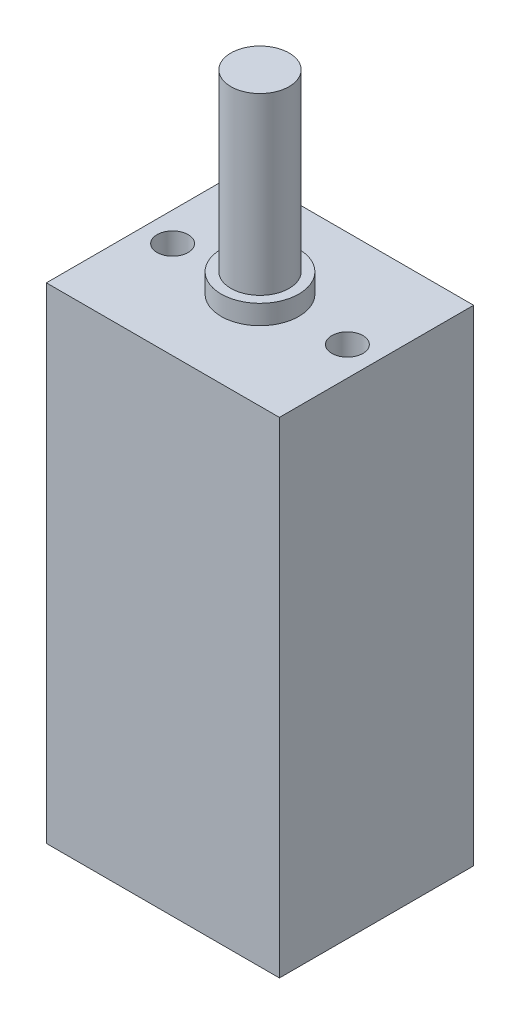
ISO-10303-21;
HEADER;
FILE_DESCRIPTION(('STEP AP214'),'2;1');
FILE_NAME('part.step','',(''),(''),'','','');
FILE_SCHEMA(('AUTOMOTIVE_DESIGN { 1 0 10303 214 1 1 1 1 }'));
ENDSEC;
DATA;
#1=APPLICATION_CONTEXT('core data for automotive mechanical design processes');
#2=APPLICATION_PROTOCOL_DEFINITION('international standard','automotive_design',2000,#1);
#3=PRODUCT_CONTEXT('',#1,'mechanical');
#4=PRODUCT('Part','Part','',(#3));
#5=PRODUCT_RELATED_PRODUCT_CATEGORY('part','',(#4));
#6=PRODUCT_DEFINITION_FORMATION('','',#4);
#7=PRODUCT_DEFINITION_CONTEXT('part definition',#1,'design');
#8=PRODUCT_DEFINITION('design','',#6,#7);
#9=PRODUCT_DEFINITION_SHAPE('','',#8);
#10=(LENGTH_UNIT() NAMED_UNIT(*) SI_UNIT(.MILLI.,.METRE.));
#11=(NAMED_UNIT(*) PLANE_ANGLE_UNIT() SI_UNIT($,.RADIAN.));
#12=(NAMED_UNIT(*) SI_UNIT($,.STERADIAN.) SOLID_ANGLE_UNIT());
#13=UNCERTAINTY_MEASURE_WITH_UNIT(LENGTH_MEASURE(1.E-05),#10,'distance_accuracy_value','');
#14=(GEOMETRIC_REPRESENTATION_CONTEXT(3) GLOBAL_UNCERTAINTY_ASSIGNED_CONTEXT((#13)) GLOBAL_UNIT_ASSIGNED_CONTEXT((#10,
#11,#12)) REPRESENTATION_CONTEXT('',''));
#15=CARTESIAN_POINT('',(0.,0.,0.));
#16=DIRECTION('',(0.,0.,1.));
#17=DIRECTION('',(1.,0.,0.));
#18=AXIS2_PLACEMENT_3D('',#15,#16,#17);
#19=CARTESIAN_POINT('',(6.,25.,-5.));
#20=DIRECTION('',(-1.,0.,0.));
#21=DIRECTION('',(0.,0.,1.));
#22=AXIS2_PLACEMENT_3D('',#19,#20,#21);
#23=PLANE('',#22);
#24=DIRECTION('',(0.,0.,-1.));
#25=VECTOR('',#24,1.);
#26=CARTESIAN_POINT('',(6.,0.,-5.));
#27=LINE('',#26,#25);
#28=CARTESIAN_POINT('',(6.,0.,5.));
#29=VERTEX_POINT('',#28);
#30=CARTESIAN_POINT('',(6.,0.,-5.));
#31=VERTEX_POINT('',#30);
#32=EDGE_CURVE('E111',#29,#31,#27,.T.);
#33=ORIENTED_EDGE('',*,*,#32,.T.);
#34=DIRECTION('',(0.,-1.,0.));
#35=VECTOR('',#34,1.);
#36=CARTESIAN_POINT('',(6.,25.,-5.));
#37=LINE('',#36,#35);
#38=CARTESIAN_POINT('',(6.,25.,-5.));
#39=VERTEX_POINT('',#38);
#40=EDGE_CURVE('E42',#39,#31,#37,.T.);
#41=ORIENTED_EDGE('',*,*,#40,.F.);
#42=DIRECTION('',(0.,0.,-1.));
#43=VECTOR('',#42,1.);
#44=CARTESIAN_POINT('',(6.,25.,-5.));
#45=LINE('',#44,#43);
#46=CARTESIAN_POINT('',(6.,25.,5.));
#47=VERTEX_POINT('',#46);
#48=EDGE_CURVE('E94',#47,#39,#45,.T.);
#49=ORIENTED_EDGE('',*,*,#48,.F.);
#50=DIRECTION('',(0.,-1.,0.));
#51=VECTOR('',#50,1.);
#52=CARTESIAN_POINT('',(6.,25.,5.));
#53=LINE('',#52,#51);
#54=EDGE_CURVE('E107',#47,#29,#53,.T.);
#55=ORIENTED_EDGE('',*,*,#54,.T.);
#56=EDGE_LOOP('',(#33,#41,#49,#55));
#57=FACE_BOUND('',#56,.T.);
#58=ADVANCED_FACE('F39',(#57),#23,.F.);
#59=CARTESIAN_POINT('',(-6.,25.,-5.));
#60=DIRECTION('',(0.,0.,1.));
#61=DIRECTION('',(1.,0.,0.));
#62=AXIS2_PLACEMENT_3D('',#59,#60,#61);
#63=PLANE('',#62);
#64=DIRECTION('',(-1.,0.,0.));
#65=VECTOR('',#64,1.);
#66=CARTESIAN_POINT('',(-6.,0.,-5.));
#67=LINE('',#66,#65);
#68=CARTESIAN_POINT('',(-6.,0.,-5.));
#69=VERTEX_POINT('',#68);
#70=EDGE_CURVE('E100',#31,#69,#67,.T.);
#71=ORIENTED_EDGE('',*,*,#70,.T.);
#72=DIRECTION('',(0.,-1.,0.));
#73=VECTOR('',#72,1.);
#74=CARTESIAN_POINT('',(-6.,25.,-5.));
#75=LINE('',#74,#73);
#76=CARTESIAN_POINT('',(-6.,25.,-5.));
#77=VERTEX_POINT('',#76);
#78=EDGE_CURVE('E98',#77,#69,#75,.T.);
#79=ORIENTED_EDGE('',*,*,#78,.F.);
#80=DIRECTION('',(-1.,0.,0.));
#81=VECTOR('',#80,1.);
#82=CARTESIAN_POINT('',(-6.,25.,-5.));
#83=LINE('',#82,#81);
#84=EDGE_CURVE('E89',#39,#77,#83,.T.);
#85=ORIENTED_EDGE('',*,*,#84,.F.);
#86=ORIENTED_EDGE('',*,*,#40,.T.);
#87=EDGE_LOOP('',(#71,#79,#85,#86));
#88=FACE_BOUND('',#87,.T.);
#89=ADVANCED_FACE('F99',(#88),#63,.F.);
#90=CARTESIAN_POINT('',(-6.,25.,-5.));
#91=DIRECTION('',(1.,0.,0.));
#92=DIRECTION('',(0.,0.,-1.));
#93=AXIS2_PLACEMENT_3D('',#90,#91,#92);
#94=PLANE('',#93);
#95=DIRECTION('',(0.,0.,1.));
#96=VECTOR('',#95,1.);
#97=CARTESIAN_POINT('',(-6.,0.,-5.));
#98=LINE('',#97,#96);
#99=CARTESIAN_POINT('',(-6.,0.,5.));
#100=VERTEX_POINT('',#99);
#101=EDGE_CURVE('E75',#69,#100,#98,.T.);
#102=ORIENTED_EDGE('',*,*,#101,.T.);
#103=DIRECTION('',(0.,-1.,0.));
#104=VECTOR('',#103,1.);
#105=CARTESIAN_POINT('',(-6.,25.,5.));
#106=LINE('',#105,#104);
#107=CARTESIAN_POINT('',(-6.,25.,5.));
#108=VERTEX_POINT('',#107);
#109=EDGE_CURVE('E102',#108,#100,#106,.T.);
#110=ORIENTED_EDGE('',*,*,#109,.F.);
#111=DIRECTION('',(0.,0.,1.));
#112=VECTOR('',#111,1.);
#113=CARTESIAN_POINT('',(-6.,25.,-5.));
#114=LINE('',#113,#112);
#115=EDGE_CURVE('E92',#77,#108,#114,.T.);
#116=ORIENTED_EDGE('',*,*,#115,.F.);
#117=ORIENTED_EDGE('',*,*,#78,.T.);
#118=EDGE_LOOP('',(#102,#110,#116,#117));
#119=FACE_BOUND('',#118,.T.);
#120=ADVANCED_FACE('F103',(#119),#94,.F.);
#121=CARTESIAN_POINT('',(-6.,25.,5.));
#122=DIRECTION('',(0.,0.,-1.));
#123=DIRECTION('',(-1.,0.,0.));
#124=AXIS2_PLACEMENT_3D('',#121,#122,#123);
#125=PLANE('',#124);
#126=DIRECTION('',(1.,0.,0.));
#127=VECTOR('',#126,1.);
#128=CARTESIAN_POINT('',(-6.,0.,5.));
#129=LINE('',#128,#127);
#130=EDGE_CURVE('E81',#100,#29,#129,.T.);
#131=ORIENTED_EDGE('',*,*,#130,.T.);
#132=ORIENTED_EDGE('',*,*,#54,.F.);
#133=DIRECTION('',(1.,0.,0.));
#134=VECTOR('',#133,1.);
#135=CARTESIAN_POINT('',(-6.,25.,5.));
#136=LINE('',#135,#134);
#137=EDGE_CURVE('E58',#108,#47,#136,.T.);
#138=ORIENTED_EDGE('',*,*,#137,.F.);
#139=ORIENTED_EDGE('',*,*,#109,.T.);
#140=EDGE_LOOP('',(#131,#132,#138,#139));
#141=FACE_BOUND('',#140,.T.);
#142=ADVANCED_FACE('F125',(#141),#125,.F.);
#143=CARTESIAN_POINT('',(0.,25.,0.));
#144=DIRECTION('',(0.,1.,0.));
#145=DIRECTION('',(0.,0.,1.));
#146=AXIS2_PLACEMENT_3D('',#143,#144,#145);
#147=PLANE('',#146);
#148=CARTESIAN_POINT('',(-4.5,25.,0.));
#149=DIRECTION('',(0.,1.,0.));
#150=DIRECTION('',(0.,0.,1.));
#151=AXIS2_PLACEMENT_3D('',#148,#149,#150);
#152=CIRCLE('',#151,0.8);
#153=CARTESIAN_POINT('',(-4.5,25.,0.8));
#154=VERTEX_POINT('',#153);
#155=EDGE_CURVE('E151',#154,#154,#152,.T.);
#156=ORIENTED_EDGE('',*,*,#155,.F.);
#157=EDGE_LOOP('',(#156));
#158=FACE_BOUND('',#157,.T.);
#159=CARTESIAN_POINT('',(4.5,25.,0.));
#160=DIRECTION('',(0.,1.,0.));
#161=DIRECTION('',(0.,0.,1.));
#162=AXIS2_PLACEMENT_3D('',#159,#160,#161);
#163=CIRCLE('',#162,0.8);
#164=CARTESIAN_POINT('',(4.5,25.,0.799999999999998));
#165=VERTEX_POINT('',#164);
#166=EDGE_CURVE('E143',#165,#165,#163,.T.);
#167=ORIENTED_EDGE('',*,*,#166,.F.);
#168=EDGE_LOOP('',(#167));
#169=FACE_BOUND('',#168,.T.);
#170=CARTESIAN_POINT('',(0.,25.,0.));
#171=DIRECTION('',(0.,1.,0.));
#172=DIRECTION('',(0.,0.,1.));
#173=AXIS2_PLACEMENT_3D('',#170,#171,#172);
#174=CIRCLE('',#173,2.);
#175=CARTESIAN_POINT('',(0.,25.,2.));
#176=VERTEX_POINT('',#175);
#177=EDGE_CURVE('E49',#176,#176,#174,.T.);
#178=ORIENTED_EDGE('',*,*,#177,.F.);
#179=EDGE_LOOP('',(#178));
#180=FACE_BOUND('',#179,.T.);
#181=ORIENTED_EDGE('',*,*,#48,.T.);
#182=ORIENTED_EDGE('',*,*,#84,.T.);
#183=ORIENTED_EDGE('',*,*,#115,.T.);
#184=ORIENTED_EDGE('',*,*,#137,.T.);
#185=EDGE_LOOP('',(#181,#182,#183,#184));
#186=FACE_BOUND('',#185,.T.);
#187=ADVANCED_FACE('F90',(#158,#169,#180,#186),#147,.T.);
#188=CARTESIAN_POINT('',(0.,0.,0.));
#189=DIRECTION('',(0.,1.,0.));
#190=DIRECTION('',(0.,0.,1.));
#191=AXIS2_PLACEMENT_3D('',#188,#189,#190);
#192=PLANE('',#191);
#193=ORIENTED_EDGE('',*,*,#32,.F.);
#194=ORIENTED_EDGE('',*,*,#130,.F.);
#195=ORIENTED_EDGE('',*,*,#101,.F.);
#196=ORIENTED_EDGE('',*,*,#70,.F.);
#197=EDGE_LOOP('',(#193,#194,#195,#196));
#198=FACE_BOUND('',#197,.T.);
#199=ADVANCED_FACE('F128',(#198),#192,.F.);
#200=CARTESIAN_POINT('',(0.,26.,0.));
#201=DIRECTION('',(0.,-1.,0.));
#202=DIRECTION('',(0.,0.,-1.));
#203=AXIS2_PLACEMENT_3D('',#200,#201,#202);
#204=CYLINDRICAL_SURFACE('',#203,2.);
#205=CARTESIAN_POINT('',(0.,26.,0.));
#206=DIRECTION('',(0.,1.,0.));
#207=DIRECTION('',(0.,0.,1.));
#208=AXIS2_PLACEMENT_3D('',#205,#206,#207);
#209=CIRCLE('',#208,2.);
#210=CARTESIAN_POINT('',(0.,26.,2.));
#211=VERTEX_POINT('',#210);
#212=EDGE_CURVE('E115',#211,#211,#209,.T.);
#213=ORIENTED_EDGE('',*,*,#212,.F.);
#214=EDGE_LOOP('',(#213));
#215=FACE_BOUND('',#214,.T.);
#216=ORIENTED_EDGE('',*,*,#177,.T.);
#217=EDGE_LOOP('',(#216));
#218=FACE_BOUND('',#217,.T.);
#219=ADVANCED_FACE('F175',(#215,#218),#204,.T.);
#220=CARTESIAN_POINT('',(0.,26.,0.));
#221=DIRECTION('',(0.,1.,0.));
#222=DIRECTION('',(0.,0.,1.));
#223=AXIS2_PLACEMENT_3D('',#220,#221,#222);
#224=PLANE('',#223);
#225=CARTESIAN_POINT('',(0.,26.,0.));
#226=DIRECTION('',(0.,1.,0.));
#227=DIRECTION('',(0.,0.,1.));
#228=AXIS2_PLACEMENT_3D('',#225,#226,#227);
#229=CIRCLE('',#228,1.5);
#230=CARTESIAN_POINT('',(0.,26.,1.5));
#231=VERTEX_POINT('',#230);
#232=EDGE_CURVE('E11',#231,#231,#229,.T.);
#233=ORIENTED_EDGE('',*,*,#232,.F.);
#234=EDGE_LOOP('',(#233));
#235=FACE_BOUND('',#234,.T.);
#236=ORIENTED_EDGE('',*,*,#212,.T.);
#237=EDGE_LOOP('',(#236));
#238=FACE_BOUND('',#237,.T.);
#239=ADVANCED_FACE('F177',(#235,#238),#224,.T.);
#240=CARTESIAN_POINT('',(0.,35.,0.));
#241=DIRECTION('',(0.,-1.,0.));
#242=DIRECTION('',(0.,0.,-1.));
#243=AXIS2_PLACEMENT_3D('',#240,#241,#242);
#244=CYLINDRICAL_SURFACE('',#243,1.5);
#245=CARTESIAN_POINT('',(0.,35.,0.));
#246=DIRECTION('',(0.,1.,0.));
#247=DIRECTION('',(0.,0.,1.));
#248=AXIS2_PLACEMENT_3D('',#245,#246,#247);
#249=CIRCLE('',#248,1.5);
#250=CARTESIAN_POINT('',(0.,35.,1.5));
#251=VERTEX_POINT('',#250);
#252=EDGE_CURVE('E137',#251,#251,#249,.T.);
#253=ORIENTED_EDGE('',*,*,#252,.F.);
#254=EDGE_LOOP('',(#253));
#255=FACE_BOUND('',#254,.T.);
#256=ORIENTED_EDGE('',*,*,#232,.T.);
#257=EDGE_LOOP('',(#256));
#258=FACE_BOUND('',#257,.T.);
#259=ADVANCED_FACE('F184',(#255,#258),#244,.T.);
#260=CARTESIAN_POINT('',(0.,35.,0.));
#261=DIRECTION('',(0.,1.,0.));
#262=DIRECTION('',(0.,0.,1.));
#263=AXIS2_PLACEMENT_3D('',#260,#261,#262);
#264=PLANE('',#263);
#265=ORIENTED_EDGE('',*,*,#252,.T.);
#266=EDGE_LOOP('',(#265));
#267=FACE_BOUND('',#266,.T.);
#268=ADVANCED_FACE('F231',(#267),#264,.T.);
#269=CARTESIAN_POINT('',(4.5,20.,0.));
#270=DIRECTION('',(0.,1.,0.));
#271=DIRECTION('',(0.,0.,1.));
#272=AXIS2_PLACEMENT_3D('',#269,#270,#271);
#273=CYLINDRICAL_SURFACE('',#272,0.8);
#274=CARTESIAN_POINT('',(4.5,20.,0.));
#275=DIRECTION('',(0.,1.,0.));
#276=DIRECTION('',(0.,0.,1.));
#277=AXIS2_PLACEMENT_3D('',#274,#275,#276);
#278=CIRCLE('',#277,0.8);
#279=CARTESIAN_POINT('',(4.5,20.,0.799999999999998));
#280=VERTEX_POINT('',#279);
#281=EDGE_CURVE('E147',#280,#280,#278,.T.);
#282=ORIENTED_EDGE('',*,*,#281,.F.);
#283=EDGE_LOOP('',(#282));
#284=FACE_BOUND('',#283,.T.);
#285=ORIENTED_EDGE('',*,*,#166,.T.);
#286=EDGE_LOOP('',(#285));
#287=FACE_BOUND('',#286,.T.);
#288=ADVANCED_FACE('F240',(#284,#287),#273,.F.);
#289=CARTESIAN_POINT('',(4.5,20.,0.));
#290=DIRECTION('',(0.,1.,0.));
#291=DIRECTION('',(0.,0.,1.));
#292=AXIS2_PLACEMENT_3D('',#289,#290,#291);
#293=PLANE('',#292);
#294=ORIENTED_EDGE('',*,*,#281,.T.);
#295=EDGE_LOOP('',(#294));
#296=FACE_BOUND('',#295,.T.);
#297=ADVANCED_FACE('F164',(#296),#293,.T.);
#298=CARTESIAN_POINT('',(-4.5,20.,0.));
#299=DIRECTION('',(0.,1.,0.));
#300=DIRECTION('',(0.,0.,1.));
#301=AXIS2_PLACEMENT_3D('',#298,#299,#300);
#302=CYLINDRICAL_SURFACE('',#301,0.8);
#303=CARTESIAN_POINT('',(-4.5,20.,0.));
#304=DIRECTION('',(0.,1.,0.));
#305=DIRECTION('',(0.,0.,1.));
#306=AXIS2_PLACEMENT_3D('',#303,#304,#305);
#307=CIRCLE('',#306,0.8);
#308=CARTESIAN_POINT('',(-4.5,20.,0.8));
#309=VERTEX_POINT('',#308);
#310=EDGE_CURVE('E142',#309,#309,#307,.T.);
#311=ORIENTED_EDGE('',*,*,#310,.F.);
#312=EDGE_LOOP('',(#311));
#313=FACE_BOUND('',#312,.T.);
#314=ORIENTED_EDGE('',*,*,#155,.T.);
#315=EDGE_LOOP('',(#314));
#316=FACE_BOUND('',#315,.T.);
#317=ADVANCED_FACE('F161',(#313,#316),#302,.F.);
#318=CARTESIAN_POINT('',(-4.5,20.,0.));
#319=DIRECTION('',(0.,1.,0.));
#320=DIRECTION('',(0.,0.,1.));
#321=AXIS2_PLACEMENT_3D('',#318,#319,#320);
#322=PLANE('',#321);
#323=ORIENTED_EDGE('',*,*,#310,.T.);
#324=EDGE_LOOP('',(#323));
#325=FACE_BOUND('',#324,.T.);
#326=ADVANCED_FACE('F159',(#325),#322,.T.);
#327=CLOSED_SHELL('',(#58,#89,#120,#142,#187,#199,#219,#239,#259,#268,#288,#297,#317,#326));
#328=MANIFOLD_SOLID_BREP('B2',#327);
#329=ADVANCED_BREP_SHAPE_REPRESENTATION('',(#18,#328),#14);
#330=SHAPE_DEFINITION_REPRESENTATION(#9,#329);
ENDSEC;
END-ISO-10303-21;
